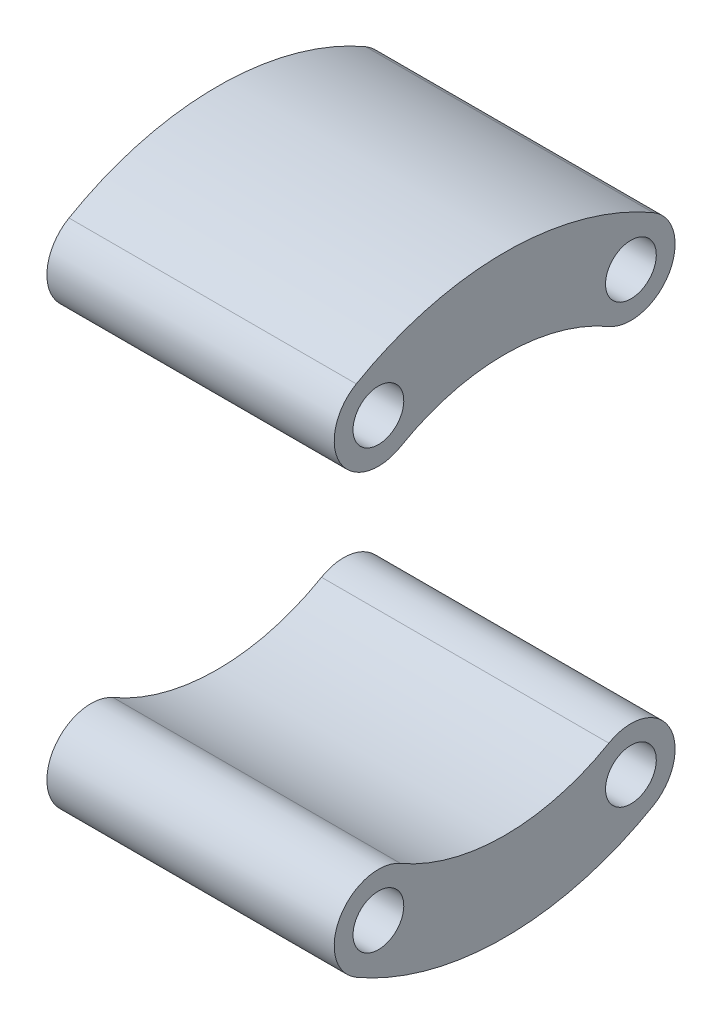
ISO-10303-21;
HEADER;
FILE_DESCRIPTION(('STEP AP214'),'2;1');
FILE_NAME('part.step','',(''),(''),'','','');
FILE_SCHEMA(('AUTOMOTIVE_DESIGN { 1 0 10303 214 1 1 1 1 }'));
ENDSEC;
DATA;
#1=APPLICATION_CONTEXT('core data for automotive mechanical design processes');
#2=APPLICATION_PROTOCOL_DEFINITION('international standard','automotive_design',2000,#1);
#3=PRODUCT_CONTEXT('',#1,'mechanical');
#4=PRODUCT('Part','Part','',(#3));
#5=PRODUCT_RELATED_PRODUCT_CATEGORY('part','',(#4));
#6=PRODUCT_DEFINITION_FORMATION('','',#4);
#7=PRODUCT_DEFINITION_CONTEXT('part definition',#1,'design');
#8=PRODUCT_DEFINITION('design','',#6,#7);
#9=PRODUCT_DEFINITION_SHAPE('','',#8);
#10=(LENGTH_UNIT() NAMED_UNIT(*) SI_UNIT(.MILLI.,.METRE.));
#11=(NAMED_UNIT(*) PLANE_ANGLE_UNIT() SI_UNIT($,.RADIAN.));
#12=(NAMED_UNIT(*) SI_UNIT($,.STERADIAN.) SOLID_ANGLE_UNIT());
#13=UNCERTAINTY_MEASURE_WITH_UNIT(LENGTH_MEASURE(1.E-05),#10,'distance_accuracy_value','');
#14=(GEOMETRIC_REPRESENTATION_CONTEXT(3) GLOBAL_UNCERTAINTY_ASSIGNED_CONTEXT((#13)) GLOBAL_UNIT_ASSIGNED_CONTEXT((#10,
#11,#12)) REPRESENTATION_CONTEXT('',''));
#15=CARTESIAN_POINT('',(0.,0.,0.));
#16=DIRECTION('',(0.,0.,1.));
#17=DIRECTION('',(1.,0.,0.));
#18=AXIS2_PLACEMENT_3D('',#15,#16,#17);
#19=CARTESIAN_POINT('',(285.75,300.961950573943,366.715339333629));
#20=DIRECTION('',(-1.,0.,0.));
#21=DIRECTION('',(0.,-1.,0.));
#22=AXIS2_PLACEMENT_3D('',#19,#20,#21);
#23=PLANE('',#22);
#24=CARTESIAN_POINT('',(285.75,279.691454743875,390.265339333629));
#25=DIRECTION('',(-1.,0.,0.));
#26=DIRECTION('',(0.,-1.,0.));
#27=AXIS2_PLACEMENT_3D('',#24,#25,#26);
#28=CIRCLE('',#27,2.5527);
#29=CARTESIAN_POINT('',(285.75,277.138754743875,390.265339333629));
#30=VERTEX_POINT('',#29);
#31=EDGE_CURVE('E140',#30,#30,#28,.F.);
#32=ORIENTED_EDGE('',*,*,#31,.T.);
#33=EDGE_LOOP('',(#32));
#34=FACE_BOUND('',#33,.T.);
#35=CARTESIAN_POINT('',(285.75,279.691454743875,415.665339333629));
#36=DIRECTION('',(-1.,0.,0.));
#37=DIRECTION('',(0.,-1.,0.));
#38=AXIS2_PLACEMENT_3D('',#35,#36,#37);
#39=CIRCLE('',#38,4.44499999999995);
#40=CARTESIAN_POINT('',(285.75,283.540937663697,413.442839333629));
#41=VERTEX_POINT('',#40);
#42=CARTESIAN_POINT('',(285.75,275.841971824053,417.887839333629));
#43=VERTEX_POINT('',#42);
#44=EDGE_CURVE('E134',#41,#43,#39,.F.);
#45=ORIENTED_EDGE('',*,*,#44,.F.);
#46=CARTESIAN_POINT('',(285.75,301.6885,402.965339333629));
#47=DIRECTION('',(-1.,0.,0.));
#48=DIRECTION('',(0.,-1.,0.));
#49=AXIS2_PLACEMENT_3D('',#46,#47,#48);
#50=CIRCLE('',#49,20.955);
#51=CARTESIAN_POINT('',(285.75,283.540937663697,392.487839333629));
#52=VERTEX_POINT('',#51);
#53=EDGE_CURVE('E71',#52,#41,#50,.T.);
#54=ORIENTED_EDGE('',*,*,#53,.F.);
#55=CARTESIAN_POINT('',(285.75,279.691454743875,390.265339333629));
#56=DIRECTION('',(-1.,0.,0.));
#57=DIRECTION('',(0.,-1.,0.));
#58=AXIS2_PLACEMENT_3D('',#55,#56,#57);
#59=CIRCLE('',#58,4.445);
#60=CARTESIAN_POINT('',(285.75,275.841971824053,388.042839333629));
#61=VERTEX_POINT('',#60);
#62=EDGE_CURVE('E98',#52,#61,#59,.T.);
#63=ORIENTED_EDGE('',*,*,#62,.T.);
#64=CARTESIAN_POINT('',(285.75,301.6885,402.965339333629));
#65=DIRECTION('',(-1.,0.,0.));
#66=DIRECTION('',(0.,-1.,0.));
#67=AXIS2_PLACEMENT_3D('',#64,#65,#66);
#68=CIRCLE('',#67,29.845);
#69=EDGE_CURVE('E144',#61,#43,#68,.T.);
#70=ORIENTED_EDGE('',*,*,#69,.T.);
#71=EDGE_LOOP('',(#45,#54,#63,#70));
#72=FACE_BOUND('',#71,.T.);
#73=CARTESIAN_POINT('',(285.75,279.691454743875,415.665339333629));
#74=DIRECTION('',(-1.,0.,0.));
#75=DIRECTION('',(0.,-1.,0.));
#76=AXIS2_PLACEMENT_3D('',#73,#74,#75);
#77=CIRCLE('',#76,2.5527);
#78=CARTESIAN_POINT('',(285.75,277.138754743875,415.665339333629));
#79=VERTEX_POINT('',#78);
#80=EDGE_CURVE('E131',#79,#79,#77,.F.);
#81=ORIENTED_EDGE('',*,*,#80,.T.);
#82=EDGE_LOOP('',(#81));
#83=FACE_BOUND('',#82,.T.);
#84=ADVANCED_FACE('F55',(#34,#72,#83),#23,.T.);
#85=CARTESIAN_POINT('',(285.748,279.691454743875,415.665339333629));
#86=DIRECTION('',(1.,0.,0.));
#87=DIRECTION('',(0.,1.,0.));
#88=AXIS2_PLACEMENT_3D('',#85,#86,#87);
#89=CYLINDRICAL_SURFACE('',#88,4.44499999999995);
#90=DIRECTION('',(1.,0.,0.));
#91=VECTOR('',#90,1.);
#92=CARTESIAN_POINT('',(285.748,283.540937663697,413.442839333629));
#93=LINE('',#92,#91);
#94=CARTESIAN_POINT('',(314.65,283.540937663697,413.442839333629));
#95=VERTEX_POINT('',#94);
#96=EDGE_CURVE('E100',#41,#95,#93,.T.);
#97=ORIENTED_EDGE('',*,*,#96,.F.);
#98=ORIENTED_EDGE('',*,*,#44,.T.);
#99=DIRECTION('',(1.,0.,0.));
#100=VECTOR('',#99,1.);
#101=CARTESIAN_POINT('',(285.748,275.841971824053,417.887839333629));
#102=LINE('',#101,#100);
#103=CARTESIAN_POINT('',(314.65,275.841971824053,417.887839333629));
#104=VERTEX_POINT('',#103);
#105=EDGE_CURVE('E12',#43,#104,#102,.T.);
#106=ORIENTED_EDGE('',*,*,#105,.T.);
#107=CARTESIAN_POINT('',(314.65,279.691454743875,415.665339333629));
#108=DIRECTION('',(1.,0.,0.));
#109=DIRECTION('',(0.,1.,0.));
#110=AXIS2_PLACEMENT_3D('',#107,#108,#109);
#111=CIRCLE('',#110,4.44500000000013);
#112=EDGE_CURVE('E118',#95,#104,#111,.T.);
#113=ORIENTED_EDGE('',*,*,#112,.F.);
#114=EDGE_LOOP('',(#97,#98,#106,#113));
#115=FACE_BOUND('',#114,.T.);
#116=ADVANCED_FACE('F159',(#115),#89,.T.);
#117=CARTESIAN_POINT('',(285.748,301.6885,402.965339333629));
#118=DIRECTION('',(1.,0.,0.));
#119=DIRECTION('',(0.,1.,0.));
#120=AXIS2_PLACEMENT_3D('',#117,#118,#119);
#121=CYLINDRICAL_SURFACE('',#120,20.955);
#122=DIRECTION('',(1.,0.,0.));
#123=VECTOR('',#122,1.);
#124=CARTESIAN_POINT('',(285.748,283.540937663697,392.487839333629));
#125=LINE('',#124,#123);
#126=CARTESIAN_POINT('',(314.65,283.540937663697,392.487839333629));
#127=VERTEX_POINT('',#126);
#128=EDGE_CURVE('E76',#52,#127,#125,.T.);
#129=ORIENTED_EDGE('',*,*,#128,.F.);
#130=ORIENTED_EDGE('',*,*,#53,.T.);
#131=ORIENTED_EDGE('',*,*,#96,.T.);
#132=CARTESIAN_POINT('',(314.65,301.6885,402.965339333629));
#133=DIRECTION('',(-1.,0.,0.));
#134=DIRECTION('',(0.,1.,0.));
#135=AXIS2_PLACEMENT_3D('',#132,#133,#134);
#136=CIRCLE('',#135,20.9550000000001);
#137=EDGE_CURVE('E108',#127,#95,#136,.T.);
#138=ORIENTED_EDGE('',*,*,#137,.F.);
#139=EDGE_LOOP('',(#129,#130,#131,#138));
#140=FACE_BOUND('',#139,.T.);
#141=ADVANCED_FACE('F113',(#140),#121,.F.);
#142=CARTESIAN_POINT('',(285.748,279.691454743875,390.265339333629));
#143=DIRECTION('',(1.,0.,0.));
#144=DIRECTION('',(0.,1.,0.));
#145=AXIS2_PLACEMENT_3D('',#142,#143,#144);
#146=CYLINDRICAL_SURFACE('',#145,4.445);
#147=ORIENTED_EDGE('',*,*,#62,.F.);
#148=ORIENTED_EDGE('',*,*,#128,.T.);
#149=CARTESIAN_POINT('',(314.65,279.691454743875,390.265339333629));
#150=DIRECTION('',(1.,0.,0.));
#151=DIRECTION('',(0.,1.,0.));
#152=AXIS2_PLACEMENT_3D('',#149,#150,#151);
#153=CIRCLE('',#152,4.44500000000014);
#154=CARTESIAN_POINT('',(314.65,275.841971824053,388.042839333629));
#155=VERTEX_POINT('',#154);
#156=EDGE_CURVE('E96',#155,#127,#153,.T.);
#157=ORIENTED_EDGE('',*,*,#156,.F.);
#158=DIRECTION('',(1.,0.,0.));
#159=VECTOR('',#158,1.);
#160=CARTESIAN_POINT('',(285.748,275.841971824053,388.042839333629));
#161=LINE('',#160,#159);
#162=EDGE_CURVE('E64',#61,#155,#161,.T.);
#163=ORIENTED_EDGE('',*,*,#162,.F.);
#164=EDGE_LOOP('',(#147,#148,#157,#163));
#165=FACE_BOUND('',#164,.T.);
#166=ADVANCED_FACE('F95',(#165),#146,.T.);
#167=CARTESIAN_POINT('',(285.748,279.691454743875,390.265339333629));
#168=DIRECTION('',(1.,0.,0.));
#169=DIRECTION('',(0.,1.,0.));
#170=AXIS2_PLACEMENT_3D('',#167,#168,#169);
#171=CYLINDRICAL_SURFACE('',#170,2.5527);
#172=ORIENTED_EDGE('',*,*,#31,.F.);
#173=EDGE_LOOP('',(#172));
#174=FACE_BOUND('',#173,.T.);
#175=CARTESIAN_POINT('',(314.65,279.691454743875,390.265339333629));
#176=DIRECTION('',(1.,0.,0.));
#177=DIRECTION('',(0.,1.,0.));
#178=AXIS2_PLACEMENT_3D('',#175,#176,#177);
#179=CIRCLE('',#178,2.55270000000003);
#180=CARTESIAN_POINT('',(314.65,282.244154743875,390.265339333629));
#181=VERTEX_POINT('',#180);
#182=EDGE_CURVE('E117',#181,#181,#179,.T.);
#183=ORIENTED_EDGE('',*,*,#182,.T.);
#184=EDGE_LOOP('',(#183));
#185=FACE_BOUND('',#184,.T.);
#186=ADVANCED_FACE('F57',(#174,#185),#171,.F.);
#187=CARTESIAN_POINT('',(285.748,301.6885,402.965339333629));
#188=DIRECTION('',(1.,0.,0.));
#189=DIRECTION('',(0.,1.,0.));
#190=AXIS2_PLACEMENT_3D('',#187,#188,#189);
#191=CYLINDRICAL_SURFACE('',#190,29.845);
#192=ORIENTED_EDGE('',*,*,#69,.F.);
#193=ORIENTED_EDGE('',*,*,#162,.T.);
#194=CARTESIAN_POINT('',(314.65,301.6885,402.965339333629));
#195=DIRECTION('',(1.,0.,0.));
#196=DIRECTION('',(0.,1.,0.));
#197=AXIS2_PLACEMENT_3D('',#194,#195,#196);
#198=CIRCLE('',#197,29.8450000000004);
#199=EDGE_CURVE('E110',#104,#155,#198,.T.);
#200=ORIENTED_EDGE('',*,*,#199,.F.);
#201=ORIENTED_EDGE('',*,*,#105,.F.);
#202=EDGE_LOOP('',(#192,#193,#200,#201));
#203=FACE_BOUND('',#202,.T.);
#204=ADVANCED_FACE('F155',(#203),#191,.T.);
#205=CARTESIAN_POINT('',(285.748,279.691454743875,415.665339333629));
#206=DIRECTION('',(1.,0.,0.));
#207=DIRECTION('',(0.,1.,0.));
#208=AXIS2_PLACEMENT_3D('',#205,#206,#207);
#209=CYLINDRICAL_SURFACE('',#208,2.5527);
#210=ORIENTED_EDGE('',*,*,#80,.F.);
#211=EDGE_LOOP('',(#210));
#212=FACE_BOUND('',#211,.T.);
#213=CARTESIAN_POINT('',(314.65,279.691454743875,415.665339333629));
#214=DIRECTION('',(1.,0.,0.));
#215=DIRECTION('',(0.,1.,0.));
#216=AXIS2_PLACEMENT_3D('',#213,#214,#215);
#217=CIRCLE('',#216,2.55270000000003);
#218=CARTESIAN_POINT('',(314.65,282.244154743875,415.665339333629));
#219=VERTEX_POINT('',#218);
#220=EDGE_CURVE('E123',#219,#219,#217,.T.);
#221=ORIENTED_EDGE('',*,*,#220,.T.);
#222=EDGE_LOOP('',(#221));
#223=FACE_BOUND('',#222,.T.);
#224=ADVANCED_FACE('F168',(#212,#223),#209,.F.);
#225=CARTESIAN_POINT('',(314.65,290.689977371938,396.615339333629));
#226=DIRECTION('',(1.,0.,0.));
#227=DIRECTION('',(0.,1.,0.));
#228=AXIS2_PLACEMENT_3D('',#225,#226,#227);
#229=PLANE('',#228);
#230=ORIENTED_EDGE('',*,*,#182,.F.);
#231=EDGE_LOOP('',(#230));
#232=FACE_BOUND('',#231,.T.);
#233=ORIENTED_EDGE('',*,*,#137,.T.);
#234=ORIENTED_EDGE('',*,*,#112,.T.);
#235=ORIENTED_EDGE('',*,*,#199,.T.);
#236=ORIENTED_EDGE('',*,*,#156,.T.);
#237=EDGE_LOOP('',(#233,#234,#235,#236));
#238=FACE_BOUND('',#237,.T.);
#239=ORIENTED_EDGE('',*,*,#220,.F.);
#240=EDGE_LOOP('',(#239));
#241=FACE_BOUND('',#240,.T.);
#242=ADVANCED_FACE('F105',(#232,#238,#241),#229,.T.);
#243=CLOSED_SHELL('',(#84,#116,#141,#166,#186,#204,#224,#242));
#244=MANIFOLD_SOLID_BREP('B2',#243);
#245=CARTESIAN_POINT('',(285.75,300.961950573943,366.715339333629));
#246=DIRECTION('',(-1.,0.,0.));
#247=DIRECTION('',(0.,-1.,0.));
#248=AXIS2_PLACEMENT_3D('',#245,#246,#247);
#249=PLANE('',#248);
#250=CARTESIAN_POINT('',(285.75,323.685545256125,390.265339333629));
#251=DIRECTION('',(-1.,0.,0.));
#252=DIRECTION('',(0.,-1.,0.));
#253=AXIS2_PLACEMENT_3D('',#250,#251,#252);
#254=CIRCLE('',#253,2.5527);
#255=CARTESIAN_POINT('',(285.75,321.132845256124,390.265339333629));
#256=VERTEX_POINT('',#255);
#257=EDGE_CURVE('E351',#256,#256,#254,.F.);
#258=ORIENTED_EDGE('',*,*,#257,.T.);
#259=EDGE_LOOP('',(#258));
#260=FACE_BOUND('',#259,.T.);
#261=CARTESIAN_POINT('',(285.75,323.685545256125,415.665339333629));
#262=DIRECTION('',(-1.,0.,0.));
#263=DIRECTION('',(0.,-1.,0.));
#264=AXIS2_PLACEMENT_3D('',#261,#262,#263);
#265=CIRCLE('',#264,4.44499999999995);
#266=CARTESIAN_POINT('',(285.75,327.535028175946,417.887839333629));
#267=VERTEX_POINT('',#266);
#268=CARTESIAN_POINT('',(285.75,319.836062336302,413.442839333629));
#269=VERTEX_POINT('',#268);
#270=EDGE_CURVE('E344',#267,#269,#265,.F.);
#271=ORIENTED_EDGE('',*,*,#270,.F.);
#272=CARTESIAN_POINT('',(285.75,301.6885,402.965339333629));
#273=DIRECTION('',(-1.,0.,0.));
#274=DIRECTION('',(0.,-1.,0.));
#275=AXIS2_PLACEMENT_3D('',#272,#273,#274);
#276=CIRCLE('',#275,29.845);
#277=CARTESIAN_POINT('',(285.75,327.535028175946,388.042839333629));
#278=VERTEX_POINT('',#277);
#279=EDGE_CURVE('E307',#267,#278,#276,.T.);
#280=ORIENTED_EDGE('',*,*,#279,.T.);
#281=CARTESIAN_POINT('',(285.75,323.685545256125,390.265339333629));
#282=DIRECTION('',(-1.,0.,0.));
#283=DIRECTION('',(0.,-1.,0.));
#284=AXIS2_PLACEMENT_3D('',#281,#282,#283);
#285=CIRCLE('',#284,4.445);
#286=CARTESIAN_POINT('',(285.75,319.836062336302,392.487839333629));
#287=VERTEX_POINT('',#286);
#288=EDGE_CURVE('E349',#278,#287,#285,.T.);
#289=ORIENTED_EDGE('',*,*,#288,.T.);
#290=CARTESIAN_POINT('',(285.75,301.6885,402.965339333629));
#291=DIRECTION('',(-1.,0.,0.));
#292=DIRECTION('',(0.,-1.,0.));
#293=AXIS2_PLACEMENT_3D('',#290,#291,#292);
#294=CIRCLE('',#293,20.955);
#295=EDGE_CURVE('E277',#269,#287,#294,.T.);
#296=ORIENTED_EDGE('',*,*,#295,.F.);
#297=EDGE_LOOP('',(#271,#280,#289,#296));
#298=FACE_BOUND('',#297,.T.);
#299=CARTESIAN_POINT('',(285.75,323.685545256125,415.665339333629));
#300=DIRECTION('',(-1.,0.,0.));
#301=DIRECTION('',(0.,-1.,0.));
#302=AXIS2_PLACEMENT_3D('',#299,#300,#301);
#303=CIRCLE('',#302,2.5527);
#304=CARTESIAN_POINT('',(285.75,321.132845256124,415.665339333629));
#305=VERTEX_POINT('',#304);
#306=EDGE_CURVE('E341',#305,#305,#303,.F.);
#307=ORIENTED_EDGE('',*,*,#306,.T.);
#308=EDGE_LOOP('',(#307));
#309=FACE_BOUND('',#308,.T.);
#310=ADVANCED_FACE('F261',(#260,#298,#309),#249,.T.);
#311=CARTESIAN_POINT('',(285.748,323.685545256125,415.665339333629));
#312=DIRECTION('',(1.,0.,0.));
#313=DIRECTION('',(0.,1.,0.));
#314=AXIS2_PLACEMENT_3D('',#311,#312,#313);
#315=CYLINDRICAL_SURFACE('',#314,4.44499999999995);
#316=DIRECTION('',(1.,0.,0.));
#317=VECTOR('',#316,1.);
#318=CARTESIAN_POINT('',(285.748,327.535028175946,417.887839333629));
#319=LINE('',#318,#317);
#320=CARTESIAN_POINT('',(314.65,327.535028175947,417.887839333629));
#321=VERTEX_POINT('',#320);
#322=EDGE_CURVE('E301',#267,#321,#319,.T.);
#323=ORIENTED_EDGE('',*,*,#322,.F.);
#324=ORIENTED_EDGE('',*,*,#270,.T.);
#325=DIRECTION('',(1.,0.,0.));
#326=VECTOR('',#325,1.);
#327=CARTESIAN_POINT('',(285.748,319.836062336302,413.442839333629));
#328=LINE('',#327,#326);
#329=CARTESIAN_POINT('',(314.65,319.836062336303,413.442839333629));
#330=VERTEX_POINT('',#329);
#331=EDGE_CURVE('E53',#269,#330,#328,.T.);
#332=ORIENTED_EDGE('',*,*,#331,.T.);
#333=CARTESIAN_POINT('',(314.65,323.685545256125,415.665339333629));
#334=DIRECTION('',(1.,0.,0.));
#335=DIRECTION('',(0.,1.,0.));
#336=AXIS2_PLACEMENT_3D('',#333,#334,#335);
#337=CIRCLE('',#336,4.44500000000015);
#338=EDGE_CURVE('E313',#321,#330,#337,.T.);
#339=ORIENTED_EDGE('',*,*,#338,.F.);
#340=EDGE_LOOP('',(#323,#324,#332,#339));
#341=FACE_BOUND('',#340,.T.);
#342=ADVANCED_FACE('F314',(#341),#315,.T.);
#343=CARTESIAN_POINT('',(285.748,301.6885,402.965339333629));
#344=DIRECTION('',(1.,0.,0.));
#345=DIRECTION('',(0.,1.,0.));
#346=AXIS2_PLACEMENT_3D('',#343,#344,#345);
#347=CYLINDRICAL_SURFACE('',#346,29.845);
#348=ORIENTED_EDGE('',*,*,#279,.F.);
#349=ORIENTED_EDGE('',*,*,#322,.T.);
#350=CARTESIAN_POINT('',(314.65,301.6885,402.965339333629));
#351=DIRECTION('',(1.,0.,0.));
#352=DIRECTION('',(0.,1.,0.));
#353=AXIS2_PLACEMENT_3D('',#350,#351,#352);
#354=CIRCLE('',#353,29.845);
#355=CARTESIAN_POINT('',(314.65,327.535028175947,388.042839333629));
#356=VERTEX_POINT('',#355);
#357=EDGE_CURVE('E305',#356,#321,#354,.T.);
#358=ORIENTED_EDGE('',*,*,#357,.F.);
#359=DIRECTION('',(1.,0.,0.));
#360=VECTOR('',#359,1.);
#361=CARTESIAN_POINT('',(285.748,327.535028175946,388.042839333629));
#362=LINE('',#361,#360);
#363=EDGE_CURVE('E310',#278,#356,#362,.T.);
#364=ORIENTED_EDGE('',*,*,#363,.F.);
#365=EDGE_LOOP('',(#348,#349,#358,#364));
#366=FACE_BOUND('',#365,.T.);
#367=ADVANCED_FACE('F303',(#366),#347,.T.);
#368=CARTESIAN_POINT('',(285.748,323.685545256125,390.265339333629));
#369=DIRECTION('',(1.,0.,0.));
#370=DIRECTION('',(0.,1.,0.));
#371=AXIS2_PLACEMENT_3D('',#368,#369,#370);
#372=CYLINDRICAL_SURFACE('',#371,4.445);
#373=ORIENTED_EDGE('',*,*,#288,.F.);
#374=ORIENTED_EDGE('',*,*,#363,.T.);
#375=CARTESIAN_POINT('',(314.65,323.685545256125,390.265339333629));
#376=DIRECTION('',(1.,0.,0.));
#377=DIRECTION('',(0.,1.,0.));
#378=AXIS2_PLACEMENT_3D('',#375,#376,#377);
#379=CIRCLE('',#378,4.44500000000019);
#380=CARTESIAN_POINT('',(314.65,319.836062336303,392.487839333629));
#381=VERTEX_POINT('',#380);
#382=EDGE_CURVE('E325',#381,#356,#379,.T.);
#383=ORIENTED_EDGE('',*,*,#382,.F.);
#384=DIRECTION('',(1.,0.,0.));
#385=VECTOR('',#384,1.);
#386=CARTESIAN_POINT('',(285.748,319.836062336302,392.487839333629));
#387=LINE('',#386,#385);
#388=EDGE_CURVE('E270',#287,#381,#387,.T.);
#389=ORIENTED_EDGE('',*,*,#388,.F.);
#390=EDGE_LOOP('',(#373,#374,#383,#389));
#391=FACE_BOUND('',#390,.T.);
#392=ADVANCED_FACE('F363',(#391),#372,.T.);
#393=CARTESIAN_POINT('',(285.748,323.685545256125,390.265339333629));
#394=DIRECTION('',(1.,0.,0.));
#395=DIRECTION('',(0.,1.,0.));
#396=AXIS2_PLACEMENT_3D('',#393,#394,#395);
#397=CYLINDRICAL_SURFACE('',#396,2.5527);
#398=ORIENTED_EDGE('',*,*,#257,.F.);
#399=EDGE_LOOP('',(#398));
#400=FACE_BOUND('',#399,.T.);
#401=CARTESIAN_POINT('',(314.65,323.685545256125,390.265339333629));
#402=DIRECTION('',(1.,0.,0.));
#403=DIRECTION('',(0.,1.,0.));
#404=AXIS2_PLACEMENT_3D('',#401,#402,#403);
#405=CIRCLE('',#404,2.55270000000003);
#406=CARTESIAN_POINT('',(314.65,326.238245256125,390.265339333629));
#407=VERTEX_POINT('',#406);
#408=EDGE_CURVE('E333',#407,#407,#405,.T.);
#409=ORIENTED_EDGE('',*,*,#408,.T.);
#410=EDGE_LOOP('',(#409));
#411=FACE_BOUND('',#410,.T.);
#412=ADVANCED_FACE('F263',(#400,#411),#397,.F.);
#413=CARTESIAN_POINT('',(285.748,301.6885,402.965339333629));
#414=DIRECTION('',(1.,0.,0.));
#415=DIRECTION('',(0.,1.,0.));
#416=AXIS2_PLACEMENT_3D('',#413,#414,#415);
#417=CYLINDRICAL_SURFACE('',#416,20.955);
#418=ORIENTED_EDGE('',*,*,#331,.F.);
#419=ORIENTED_EDGE('',*,*,#295,.T.);
#420=ORIENTED_EDGE('',*,*,#388,.T.);
#421=CARTESIAN_POINT('',(314.65,301.6885,402.965339333629));
#422=DIRECTION('',(-1.,0.,0.));
#423=DIRECTION('',(0.,1.,0.));
#424=AXIS2_PLACEMENT_3D('',#421,#422,#423);
#425=CIRCLE('',#424,20.9549999999996);
#426=EDGE_CURVE('E319',#330,#381,#425,.T.);
#427=ORIENTED_EDGE('',*,*,#426,.F.);
#428=EDGE_LOOP('',(#418,#419,#420,#427));
#429=FACE_BOUND('',#428,.T.);
#430=ADVANCED_FACE('F360',(#429),#417,.F.);
#431=CARTESIAN_POINT('',(285.748,323.685545256125,415.665339333629));
#432=DIRECTION('',(1.,0.,0.));
#433=DIRECTION('',(0.,1.,0.));
#434=AXIS2_PLACEMENT_3D('',#431,#432,#433);
#435=CYLINDRICAL_SURFACE('',#434,2.5527);
#436=ORIENTED_EDGE('',*,*,#306,.F.);
#437=EDGE_LOOP('',(#436));
#438=FACE_BOUND('',#437,.T.);
#439=CARTESIAN_POINT('',(314.65,323.685545256125,415.665339333629));
#440=DIRECTION('',(1.,0.,0.));
#441=DIRECTION('',(0.,1.,0.));
#442=AXIS2_PLACEMENT_3D('',#439,#440,#441);
#443=CIRCLE('',#442,2.55270000000003);
#444=CARTESIAN_POINT('',(314.65,326.238245256125,415.665339333629));
#445=VERTEX_POINT('',#444);
#446=EDGE_CURVE('E327',#445,#445,#443,.T.);
#447=ORIENTED_EDGE('',*,*,#446,.T.);
#448=EDGE_LOOP('',(#447));
#449=FACE_BOUND('',#448,.T.);
#450=ADVANCED_FACE('F368',(#438,#449),#435,.F.);
#451=CARTESIAN_POINT('',(314.65,312.687022628062,409.315339333629));
#452=DIRECTION('',(1.,0.,0.));
#453=DIRECTION('',(0.,1.,0.));
#454=AXIS2_PLACEMENT_3D('',#451,#452,#453);
#455=PLANE('',#454);
#456=ORIENTED_EDGE('',*,*,#446,.F.);
#457=EDGE_LOOP('',(#456));
#458=FACE_BOUND('',#457,.T.);
#459=ORIENTED_EDGE('',*,*,#357,.T.);
#460=ORIENTED_EDGE('',*,*,#338,.T.);
#461=ORIENTED_EDGE('',*,*,#426,.T.);
#462=ORIENTED_EDGE('',*,*,#382,.T.);
#463=EDGE_LOOP('',(#459,#460,#461,#462));
#464=FACE_BOUND('',#463,.T.);
#465=ORIENTED_EDGE('',*,*,#408,.F.);
#466=EDGE_LOOP('',(#465));
#467=FACE_BOUND('',#466,.T.);
#468=ADVANCED_FACE('F322',(#458,#464,#467),#455,.T.);
#469=CLOSED_SHELL('',(#310,#342,#367,#392,#412,#430,#450,#468));
#470=MANIFOLD_SOLID_BREP('B6',#469);
#471=ADVANCED_BREP_SHAPE_REPRESENTATION('',(#18,#244,#470),#14);
#472=SHAPE_DEFINITION_REPRESENTATION(#9,#471);
ENDSEC;
END-ISO-10303-21;
